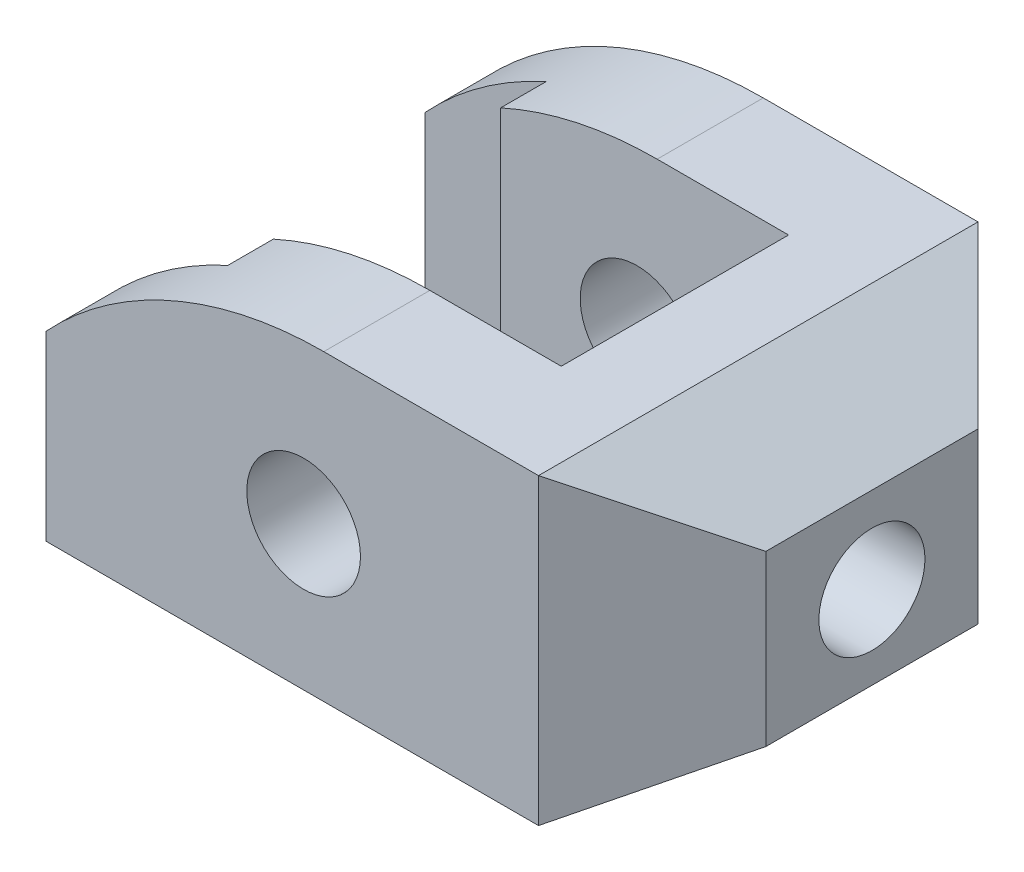
ISO-10303-21;
HEADER;
FILE_DESCRIPTION(('STEP AP214'),'2;1');
FILE_NAME('part.step','',(''),(''),'','','');
FILE_SCHEMA(('AUTOMOTIVE_DESIGN { 1 0 10303 214 1 1 1 1 }'));
ENDSEC;
DATA;
#1=APPLICATION_CONTEXT('core data for automotive mechanical design processes');
#2=APPLICATION_PROTOCOL_DEFINITION('international standard','automotive_design',2000,#1);
#3=PRODUCT_CONTEXT('',#1,'mechanical');
#4=PRODUCT('Part','Part','',(#3));
#5=PRODUCT_RELATED_PRODUCT_CATEGORY('part','',(#4));
#6=PRODUCT_DEFINITION_FORMATION('','',#4);
#7=PRODUCT_DEFINITION_CONTEXT('part definition',#1,'design');
#8=PRODUCT_DEFINITION('design','',#6,#7);
#9=PRODUCT_DEFINITION_SHAPE('','',#8);
#10=(LENGTH_UNIT() NAMED_UNIT(*) SI_UNIT(.MILLI.,.METRE.));
#11=(NAMED_UNIT(*) PLANE_ANGLE_UNIT() SI_UNIT($,.RADIAN.));
#12=(NAMED_UNIT(*) SI_UNIT($,.STERADIAN.) SOLID_ANGLE_UNIT());
#13=UNCERTAINTY_MEASURE_WITH_UNIT(LENGTH_MEASURE(1.E-05),#10,'distance_accuracy_value','');
#14=(GEOMETRIC_REPRESENTATION_CONTEXT(3) GLOBAL_UNCERTAINTY_ASSIGNED_CONTEXT((#13)) GLOBAL_UNIT_ASSIGNED_CONTEXT((#10,
#11,#12)) REPRESENTATION_CONTEXT('',''));
#15=CARTESIAN_POINT('',(0.,0.,0.));
#16=DIRECTION('',(0.,0.,1.));
#17=DIRECTION('',(1.,0.,0.));
#18=AXIS2_PLACEMENT_3D('',#15,#16,#17);
#19=CARTESIAN_POINT('',(0.,0.,-58.));
#20=DIRECTION('',(-1.,0.,0.));
#21=DIRECTION('',(0.,0.,1.));
#22=AXIS2_PLACEMENT_3D('',#19,#20,#21);
#23=PLANE('',#22);
#24=DIRECTION('',(0.,-1.,0.));
#25=VECTOR('',#24,1.);
#26=CARTESIAN_POINT('',(0.,40.,-8.));
#27=LINE('',#26,#25);
#28=CARTESIAN_POINT('',(0.,24.,-8.));
#29=VERTEX_POINT('',#28);
#30=CARTESIAN_POINT('',(0.,0.,-8.));
#31=VERTEX_POINT('',#30);
#32=EDGE_CURVE('E202',#29,#31,#27,.T.);
#33=ORIENTED_EDGE('',*,*,#32,.T.);
#34=DIRECTION('',(0.,0.,1.));
#35=VECTOR('',#34,1.);
#36=CARTESIAN_POINT('',(0.,0.,-58.));
#37=LINE('',#36,#35);
#38=CARTESIAN_POINT('',(0.,0.,0.));
#39=VERTEX_POINT('',#38);
#40=EDGE_CURVE('E279',#31,#39,#37,.T.);
#41=ORIENTED_EDGE('',*,*,#40,.T.);
#42=DIRECTION('',(0.,-1.,0.));
#43=VECTOR('',#42,1.);
#44=CARTESIAN_POINT('',(0.,0.,0.));
#45=LINE('',#44,#43);
#46=CARTESIAN_POINT('',(0.,24.,0.));
#47=VERTEX_POINT('',#46);
#48=EDGE_CURVE('E266',#47,#39,#45,.T.);
#49=ORIENTED_EDGE('',*,*,#48,.F.);
#50=DIRECTION('',(0.,0.,1.));
#51=VECTOR('',#50,1.);
#52=CARTESIAN_POINT('',(0.,24.,-58.));
#53=LINE('',#52,#51);
#54=EDGE_CURVE('E51',#29,#47,#53,.T.);
#55=ORIENTED_EDGE('',*,*,#54,.F.);
#56=EDGE_LOOP('',(#33,#41,#49,#55));
#57=FACE_BOUND('',#56,.T.);
#58=ADVANCED_FACE('F42',(#57),#23,.T.);
#59=CARTESIAN_POINT('',(36.6606055596467,-10.,-58.));
#60=DIRECTION('',(0.,0.,1.));
#61=DIRECTION('',(1.,0.,0.));
#62=AXIS2_PLACEMENT_3D('',#59,#60,#61);
#63=CYLINDRICAL_SURFACE('',#62,50.);
#64=CARTESIAN_POINT('',(36.6606055596467,-10.,-8.));
#65=DIRECTION('',(0.,0.,1.));
#66=DIRECTION('',(1.,0.,0.));
#67=AXIS2_PLACEMENT_3D('',#64,#65,#66);
#68=CIRCLE('',#67,50.);
#69=CARTESIAN_POINT('',(16.,35.5317403347236,-8.));
#70=VERTEX_POINT('',#69);
#71=EDGE_CURVE('E238',#29,#70,#68,.F.);
#72=ORIENTED_EDGE('',*,*,#71,.F.);
#73=ORIENTED_EDGE('',*,*,#54,.T.);
#74=CARTESIAN_POINT('',(36.6606055596467,-10.,0.));
#75=DIRECTION('',(0.,0.,1.));
#76=DIRECTION('',(-1.,0.,0.));
#77=AXIS2_PLACEMENT_3D('',#74,#75,#76);
#78=CIRCLE('',#77,50.);
#79=CARTESIAN_POINT('',(36.6606055596467,40.,0.));
#80=VERTEX_POINT('',#79);
#81=EDGE_CURVE('E272',#80,#47,#78,.T.);
#82=ORIENTED_EDGE('',*,*,#81,.F.);
#83=DIRECTION('',(0.,0.,1.));
#84=VECTOR('',#83,1.);
#85=CARTESIAN_POINT('',(36.6606055596467,40.,-58.));
#86=LINE('',#85,#84);
#87=CARTESIAN_POINT('',(36.6606055596467,40.,-14.));
#88=VERTEX_POINT('',#87);
#89=EDGE_CURVE('E291',#88,#80,#86,.T.);
#90=ORIENTED_EDGE('',*,*,#89,.F.);
#91=CARTESIAN_POINT('',(36.6606055596467,-10.,-14.));
#92=DIRECTION('',(0.,0.,1.));
#93=DIRECTION('',(1.,0.,0.));
#94=AXIS2_PLACEMENT_3D('',#91,#92,#93);
#95=CIRCLE('',#94,50.);
#96=CARTESIAN_POINT('',(16.,35.5317403347236,-14.));
#97=VERTEX_POINT('',#96);
#98=EDGE_CURVE('E230',#97,#88,#95,.F.);
#99=ORIENTED_EDGE('',*,*,#98,.F.);
#100=DIRECTION('',(0.,0.,1.));
#101=VECTOR('',#100,1.);
#102=CARTESIAN_POINT('',(16.,35.5317403347236,-58.));
#103=LINE('',#102,#101);
#104=EDGE_CURVE('E236',#70,#97,#103,.F.);
#105=ORIENTED_EDGE('',*,*,#104,.F.);
#106=EDGE_LOOP('',(#72,#73,#82,#90,#99,#105));
#107=FACE_BOUND('',#106,.T.);
#108=ADVANCED_FACE('F330',(#107),#63,.T.);
#109=CARTESIAN_POINT('',(34.,19.,-58.));
#110=DIRECTION('',(0.,0.,1.));
#111=DIRECTION('',(1.,0.,0.));
#112=AXIS2_PLACEMENT_3D('',#109,#110,#111);
#113=CYLINDRICAL_SURFACE('',#112,7.5);
#114=CARTESIAN_POINT('',(34.,19.,-14.));
#115=DIRECTION('',(0.,0.,1.));
#116=DIRECTION('',(1.,0.,0.));
#117=AXIS2_PLACEMENT_3D('',#114,#115,#116);
#118=CIRCLE('',#117,7.5);
#119=CARTESIAN_POINT('',(41.5,19.,-14.));
#120=VERTEX_POINT('',#119);
#121=EDGE_CURVE('E229',#120,#120,#118,.F.);
#122=CARTESIAN_POINT('',(34.,19.,0.));
#123=DIRECTION('',(0.,0.,1.));
#124=DIRECTION('',(1.,0.,0.));
#125=AXIS2_PLACEMENT_3D('',#122,#123,#124);
#126=CIRCLE('',#125,7.5);
#127=CARTESIAN_POINT('',(41.5,19.,0.));
#128=VERTEX_POINT('',#127);
#129=EDGE_CURVE('E262',#128,#128,#126,.T.);
#130=CARTESIAN_POINT('',(41.5,19.,-14.));
#131=CARTESIAN_POINT('',(41.5,19.,-13.8541666666667));
#132=CARTESIAN_POINT('',(41.5,19.,-13.7083333333333));
#133=CARTESIAN_POINT('',(41.5,19.,-13.4166666666667));
#134=CARTESIAN_POINT('',(41.5,19.,-13.2708333333333));
#135=CARTESIAN_POINT('',(41.5,19.,-12.9791666666667));
#136=CARTESIAN_POINT('',(41.5,19.,-12.8333333333333));
#137=CARTESIAN_POINT('',(41.5,19.,-12.5416666666667));
#138=CARTESIAN_POINT('',(41.5,19.,-12.3958333333333));
#139=CARTESIAN_POINT('',(41.5,19.,-12.1041666666667));
#140=CARTESIAN_POINT('',(41.5,19.,-11.9583333333333));
#141=CARTESIAN_POINT('',(41.5,19.,-11.6666666666667));
#142=CARTESIAN_POINT('',(41.5,19.,-11.5208333333333));
#143=CARTESIAN_POINT('',(41.5,19.,-11.2291666666667));
#144=CARTESIAN_POINT('',(41.5,19.,-11.0833333333333));
#145=CARTESIAN_POINT('',(41.5,19.,-10.7916666666667));
#146=CARTESIAN_POINT('',(41.5,19.,-10.6458333333333));
#147=CARTESIAN_POINT('',(41.5,19.,-10.3541666666667));
#148=CARTESIAN_POINT('',(41.5,19.,-10.2083333333333));
#149=CARTESIAN_POINT('',(41.5,19.,-9.91666666666667));
#150=CARTESIAN_POINT('',(41.5,19.,-9.77083333333333));
#151=CARTESIAN_POINT('',(41.5,19.,-9.47916666666667));
#152=CARTESIAN_POINT('',(41.5,19.,-9.33333333333333));
#153=CARTESIAN_POINT('',(41.5,19.,-9.04166666666667));
#154=CARTESIAN_POINT('',(41.5,19.,-8.89583333333333));
#155=CARTESIAN_POINT('',(41.5,19.,-8.60416666666667));
#156=CARTESIAN_POINT('',(41.5,19.,-8.45833333333333));
#157=CARTESIAN_POINT('',(41.5,19.,-8.16666666666667));
#158=CARTESIAN_POINT('',(41.5,19.,-8.02083333333333));
#159=CARTESIAN_POINT('',(41.5,19.,-7.72916666666667));
#160=CARTESIAN_POINT('',(41.5,19.,-7.58333333333333));
#161=CARTESIAN_POINT('',(41.5,19.,-7.29166666666667));
#162=CARTESIAN_POINT('',(41.5,19.,-7.14583333333333));
#163=CARTESIAN_POINT('',(41.5,19.,-6.85416666666667));
#164=CARTESIAN_POINT('',(41.5,19.,-6.70833333333333));
#165=CARTESIAN_POINT('',(41.5,19.,-6.41666666666667));
#166=CARTESIAN_POINT('',(41.5,19.,-6.27083333333333));
#167=CARTESIAN_POINT('',(41.5,19.,-5.97916666666667));
#168=CARTESIAN_POINT('',(41.5,19.,-5.83333333333333));
#169=CARTESIAN_POINT('',(41.5,19.,-5.54166666666666));
#170=CARTESIAN_POINT('',(41.5,19.,-5.39583333333333));
#171=CARTESIAN_POINT('',(41.5,19.,-5.10416666666666));
#172=CARTESIAN_POINT('',(41.5,19.,-4.95833333333333));
#173=CARTESIAN_POINT('',(41.5,19.,-4.66666666666667));
#174=CARTESIAN_POINT('',(41.5,19.,-4.52083333333333));
#175=CARTESIAN_POINT('',(41.5,19.,-4.22916666666667));
#176=CARTESIAN_POINT('',(41.5,19.,-4.08333333333333));
#177=CARTESIAN_POINT('',(41.5,19.,-3.79166666666667));
#178=CARTESIAN_POINT('',(41.5,19.,-3.64583333333333));
#179=CARTESIAN_POINT('',(41.5,19.,-3.35416666666667));
#180=CARTESIAN_POINT('',(41.5,19.,-3.20833333333333));
#181=CARTESIAN_POINT('',(41.5,19.,-2.91666666666666));
#182=CARTESIAN_POINT('',(41.5,19.,-2.77083333333333));
#183=CARTESIAN_POINT('',(41.5,19.,-2.47916666666667));
#184=CARTESIAN_POINT('',(41.5,19.,-2.33333333333334));
#185=CARTESIAN_POINT('',(41.5,19.,-2.04166666666667));
#186=CARTESIAN_POINT('',(41.5,19.,-1.89583333333333));
#187=CARTESIAN_POINT('',(41.5,19.,-1.60416666666667));
#188=CARTESIAN_POINT('',(41.5,19.,-1.45833333333333));
#189=CARTESIAN_POINT('',(41.5,19.,-1.16666666666667));
#190=CARTESIAN_POINT('',(41.5,19.,-1.02083333333333));
#191=CARTESIAN_POINT('',(41.5,19.,-0.729166666666667));
#192=CARTESIAN_POINT('',(41.5,19.,-0.583333333333334));
#193=CARTESIAN_POINT('',(41.5,19.,-0.291666666666667));
#194=CARTESIAN_POINT('',(41.5,19.,-0.145833333333333));
#195=CARTESIAN_POINT('',(41.5,19.,0.));
#196=B_SPLINE_CURVE_WITH_KNOTS('',3,(#130,#131,#132,#133,#134,#135,#136,#137,#138,#139,#140,
#141,#142,#143,#144,#145,#146,#147,#148,#149,#150,#151,#152,#153,#154,#155,#156,#157,#158,#159,
#160,#161,#162,#163,#164,#165,#166,#167,#168,#169,#170,#171,#172,#173,#174,#175,#176,#177,#178,
#179,#180,#181,#182,#183,#184,#185,#186,#187,#188,#189,#190,#191,#192,#193,#194,#195),
.UNSPECIFIED.,.F.,.F.,(4,2,2,2,2,2,2,2,2,2,2,2,2,2,2,2,2,2,2,2,2,2,2,2,2,2,2,2,2,2,2,2,4),(0.,
0.4375,0.875000000000001,1.3125,1.75,2.1875,2.625,3.0625,3.5,3.9375,4.375,4.8125,5.25,5.6875,
6.125,6.5625,7.,7.4375,7.875,8.3125,8.75,9.1875,9.62499999999999,10.0625,10.5,10.9375,11.375,
11.8125,12.25,12.6875,13.125,13.5625,14.),.UNSPECIFIED.);
#197=EDGE_CURVE('BSEAM309',#120,#128,#196,.T.);
#198=ORIENTED_EDGE('',*,*,#121,.T.);
#199=ORIENTED_EDGE('',*,*,#129,.T.);
#200=ORIENTED_EDGE('',*,*,#197,.T.);
#201=ORIENTED_EDGE('',*,*,#197,.F.);
#202=EDGE_LOOP('',(#198,#200,#199,#201));
#203=FACE_BOUND('',#202,.T.);
#204=ADVANCED_FACE('F309',(#203),#113,.F.);
#205=CARTESIAN_POINT('',(80.,31.3397459621556,-58.));
#206=DIRECTION('',(0.500000000000001,0.866025403784438,0.));
#207=DIRECTION('',(-0.866025403784438,0.500000000000001,0.));
#208=AXIS2_PLACEMENT_3D('',#205,#206,#207);
#209=PLANE('',#208);
#210=DIRECTION('',(0.,0.,1.));
#211=VECTOR('',#210,1.);
#212=CARTESIAN_POINT('',(80.,31.3397459621556,-58.));
#213=LINE('',#212,#211);
#214=CARTESIAN_POINT('',(80.,31.3397459621556,-43.0000000000002));
#215=VERTEX_POINT('',#214);
#216=CARTESIAN_POINT('',(80.,31.3397459621556,-14.9999999999999));
#217=VERTEX_POINT('',#216);
#218=EDGE_CURVE('E295',#215,#217,#213,.T.);
#219=ORIENTED_EDGE('',*,*,#218,.F.);
#220=DIRECTION('',(-0.65465367070798,0.37796447300923,-0.654653670707973));
#221=VECTOR('',#220,1.);
#222=CARTESIAN_POINT('',(73.5714285714287,35.051283406946,-49.4285714285714));
#223=LINE('',#222,#221);
#224=CARTESIAN_POINT('',(65.,40.,-58.));
#225=VERTEX_POINT('',#224);
#226=EDGE_CURVE('E259',#215,#225,#223,.T.);
#227=ORIENTED_EDGE('',*,*,#226,.T.);
#228=DIRECTION('',(0.,0.,1.));
#229=VECTOR('',#228,1.);
#230=CARTESIAN_POINT('',(65.,40.,-58.));
#231=LINE('',#230,#229);
#232=CARTESIAN_POINT('',(65.,40.,0.));
#233=VERTEX_POINT('',#232);
#234=EDGE_CURVE('E292',#225,#233,#231,.T.);
#235=ORIENTED_EDGE('',*,*,#234,.T.);
#236=DIRECTION('',(0.65465367070798,-0.37796447300923,-0.654653670707973));
#237=VECTOR('',#236,1.);
#238=CARTESIAN_POINT('',(98.4285714285714,20.7000052870896,-33.4285714285711));
#239=LINE('',#238,#237);
#240=EDGE_CURVE('E253',#233,#217,#239,.T.);
#241=ORIENTED_EDGE('',*,*,#240,.T.);
#242=EDGE_LOOP('',(#219,#227,#235,#241));
#243=FACE_BOUND('',#242,.T.);
#244=ADVANCED_FACE('F402',(#243),#209,.T.);
#245=CARTESIAN_POINT('',(80.,9.02926263095334,-58.));
#246=DIRECTION('',(1.,0.,0.));
#247=DIRECTION('',(0.,0.,-1.));
#248=AXIS2_PLACEMENT_3D('',#245,#246,#247);
#249=PLANE('',#248);
#250=CARTESIAN_POINT('',(80.,20.,-29.));
#251=DIRECTION('',(1.,0.,0.));
#252=DIRECTION('',(0.,0.,-1.));
#253=AXIS2_PLACEMENT_3D('',#250,#251,#252);
#254=CIRCLE('',#253,7.);
#255=CARTESIAN_POINT('',(80.,20.,-36.));
#256=VERTEX_POINT('',#255);
#257=EDGE_CURVE('E199',#256,#256,#254,.T.);
#258=ORIENTED_EDGE('',*,*,#257,.F.);
#259=EDGE_LOOP('',(#258));
#260=FACE_BOUND('',#259,.T.);
#261=DIRECTION('',(0.,0.,1.));
#262=VECTOR('',#261,1.);
#263=CARTESIAN_POINT('',(80.,9.02926263095334,-58.));
#264=LINE('',#263,#262);
#265=CARTESIAN_POINT('',(80.,9.02926263095334,-43.0000000000002));
#266=VERTEX_POINT('',#265);
#267=CARTESIAN_POINT('',(80.,9.02926263095334,-14.9999999999999));
#268=VERTEX_POINT('',#267);
#269=EDGE_CURVE('E298',#266,#268,#264,.T.);
#270=ORIENTED_EDGE('',*,*,#269,.F.);
#271=DIRECTION('',(0.,-1.,0.));
#272=VECTOR('',#271,1.);
#273=CARTESIAN_POINT('',(80.,40.,-43.0000000000002));
#274=LINE('',#273,#272);
#275=EDGE_CURVE('E241',#215,#266,#274,.T.);
#276=ORIENTED_EDGE('',*,*,#275,.F.);
#277=ORIENTED_EDGE('',*,*,#218,.T.);
#278=DIRECTION('',(0.,-1.,0.));
#279=VECTOR('',#278,1.);
#280=CARTESIAN_POINT('',(80.,40.,-14.9999999999999));
#281=LINE('',#280,#279);
#282=EDGE_CURVE('E240',#217,#268,#281,.T.);
#283=ORIENTED_EDGE('',*,*,#282,.T.);
#284=EDGE_LOOP('',(#270,#276,#277,#283));
#285=FACE_BOUND('',#284,.T.);
#286=ADVANCED_FACE('F405',(#260,#285),#249,.T.);
#287=CARTESIAN_POINT('',(65.,0.,-58.));
#288=DIRECTION('',(0.515724192489074,-0.856754665748307,0.));
#289=DIRECTION('',(0.856754665748307,0.515724192489074,0.));
#290=AXIS2_PLACEMENT_3D('',#287,#288,#289);
#291=PLANE('',#290);
#292=DIRECTION('',(0.,0.,1.));
#293=VECTOR('',#292,1.);
#294=CARTESIAN_POINT('',(65.,0.,-58.));
#295=LINE('',#294,#293);
#296=CARTESIAN_POINT('',(65.,0.,-58.));
#297=VERTEX_POINT('',#296);
#298=CARTESIAN_POINT('',(65.,0.,0.));
#299=VERTEX_POINT('',#298);
#300=EDGE_CURVE('E301',#297,#299,#295,.T.);
#301=ORIENTED_EDGE('',*,*,#300,.F.);
#302=DIRECTION('',(0.650621417420144,0.39164211008064,0.650621417420137));
#303=VECTOR('',#302,1.);
#304=CARTESIAN_POINT('',(65.,0.,-58.));
#305=LINE('',#304,#303);
#306=EDGE_CURVE('E256',#297,#266,#305,.T.);
#307=ORIENTED_EDGE('',*,*,#306,.T.);
#308=ORIENTED_EDGE('',*,*,#269,.T.);
#309=DIRECTION('',(-0.650621417420144,-0.39164211008064,0.650621417420137));
#310=VECTOR('',#309,1.);
#311=CARTESIAN_POINT('',(89.5518772707359,14.7790231973606,-24.5518772707357));
#312=LINE('',#311,#310);
#313=EDGE_CURVE('E247',#268,#299,#312,.T.);
#314=ORIENTED_EDGE('',*,*,#313,.T.);
#315=EDGE_LOOP('',(#301,#307,#308,#314));
#316=FACE_BOUND('',#315,.T.);
#317=ADVANCED_FACE('F397',(#316),#291,.T.);
#318=CARTESIAN_POINT('',(36.6606055596467,-10.,-58.));
#319=DIRECTION('',(0.,0.,-1.));
#320=DIRECTION('',(-1.,0.,0.));
#321=AXIS2_PLACEMENT_3D('',#318,#319,#320);
#322=PLANE('',#321);
#323=CARTESIAN_POINT('',(34.,19.,-58.));
#324=DIRECTION('',(0.,0.,1.));
#325=DIRECTION('',(1.,0.,0.));
#326=AXIS2_PLACEMENT_3D('',#323,#324,#325);
#327=CIRCLE('',#326,7.5);
#328=CARTESIAN_POINT('',(41.5,19.,-58.));
#329=VERTEX_POINT('',#328);
#330=EDGE_CURVE('E263',#329,#329,#327,.T.);
#331=ORIENTED_EDGE('',*,*,#330,.T.);
#332=EDGE_LOOP('',(#331));
#333=FACE_BOUND('',#332,.T.);
#334=DIRECTION('',(-1.,0.,0.));
#335=VECTOR('',#334,1.);
#336=CARTESIAN_POINT('',(65.,40.,-58.));
#337=LINE('',#336,#335);
#338=CARTESIAN_POINT('',(36.6606055596467,40.,-58.));
#339=VERTEX_POINT('',#338);
#340=EDGE_CURVE('E274',#225,#339,#337,.T.);
#341=ORIENTED_EDGE('',*,*,#340,.F.);
#342=DIRECTION('',(0.,-1.,0.));
#343=VECTOR('',#342,1.);
#344=CARTESIAN_POINT('',(65.,40.,-58.));
#345=LINE('',#344,#343);
#346=EDGE_CURVE('E243',#225,#297,#345,.T.);
#347=ORIENTED_EDGE('',*,*,#346,.T.);
#348=DIRECTION('',(1.,0.,0.));
#349=VECTOR('',#348,1.);
#350=CARTESIAN_POINT('',(0.,0.,-58.));
#351=LINE('',#350,#349);
#352=CARTESIAN_POINT('',(0.,0.,-58.));
#353=VERTEX_POINT('',#352);
#354=EDGE_CURVE('E271',#353,#297,#351,.T.);
#355=ORIENTED_EDGE('',*,*,#354,.F.);
#356=DIRECTION('',(0.,-1.,0.));
#357=VECTOR('',#356,1.);
#358=CARTESIAN_POINT('',(0.,0.,-58.));
#359=LINE('',#358,#357);
#360=CARTESIAN_POINT('',(0.,24.,-58.));
#361=VERTEX_POINT('',#360);
#362=EDGE_CURVE('E269',#361,#353,#359,.T.);
#363=ORIENTED_EDGE('',*,*,#362,.F.);
#364=CARTESIAN_POINT('',(36.6606055596467,-10.,-58.));
#365=DIRECTION('',(0.,0.,1.));
#366=DIRECTION('',(-1.,0.,0.));
#367=AXIS2_PLACEMENT_3D('',#364,#365,#366);
#368=CIRCLE('',#367,50.);
#369=EDGE_CURVE('E276',#339,#361,#368,.T.);
#370=ORIENTED_EDGE('',*,*,#369,.F.);
#371=EDGE_LOOP('',(#341,#347,#355,#363,#370));
#372=FACE_BOUND('',#371,.T.);
#373=ADVANCED_FACE('F345',(#333,#372),#322,.T.);
#374=CARTESIAN_POINT('',(36.6606055596467,-10.,0.));
#375=DIRECTION('',(0.,0.,-1.));
#376=DIRECTION('',(-1.,0.,0.));
#377=AXIS2_PLACEMENT_3D('',#374,#375,#376);
#378=PLANE('',#377);
#379=ORIENTED_EDGE('',*,*,#129,.F.);
#380=EDGE_LOOP('',(#379));
#381=FACE_BOUND('',#380,.T.);
#382=DIRECTION('',(0.,-1.,0.));
#383=VECTOR('',#382,1.);
#384=CARTESIAN_POINT('',(65.,40.,0.));
#385=LINE('',#384,#383);
#386=EDGE_CURVE('E244',#233,#299,#385,.T.);
#387=ORIENTED_EDGE('',*,*,#386,.F.);
#388=DIRECTION('',(-1.,0.,0.));
#389=VECTOR('',#388,1.);
#390=CARTESIAN_POINT('',(65.,40.,0.));
#391=LINE('',#390,#389);
#392=EDGE_CURVE('E285',#233,#80,#391,.T.);
#393=ORIENTED_EDGE('',*,*,#392,.T.);
#394=ORIENTED_EDGE('',*,*,#81,.T.);
#395=ORIENTED_EDGE('',*,*,#48,.T.);
#396=DIRECTION('',(1.,0.,0.));
#397=VECTOR('',#396,1.);
#398=CARTESIAN_POINT('',(0.,0.,0.));
#399=LINE('',#398,#397);
#400=EDGE_CURVE('E282',#39,#299,#399,.T.);
#401=ORIENTED_EDGE('',*,*,#400,.T.);
#402=EDGE_LOOP('',(#387,#393,#394,#395,#401));
#403=FACE_BOUND('',#402,.T.);
#404=ADVANCED_FACE('F338',(#381,#403),#378,.F.);
#405=DIRECTION('',(0.,-1.,0.));
#406=VECTOR('',#405,1.);
#407=CARTESIAN_POINT('',(0.,40.,-50.));
#408=LINE('',#407,#406);
#409=CARTESIAN_POINT('',(0.,24.,-50.));
#410=VERTEX_POINT('',#409);
#411=CARTESIAN_POINT('',(0.,0.,-50.));
#412=VERTEX_POINT('',#411);
#413=EDGE_CURVE('E59',#410,#412,#408,.T.);
#414=ORIENTED_EDGE('',*,*,#413,.F.);
#415=EDGE_CURVE('E11',#361,#410,#53,.T.);
#416=ORIENTED_EDGE('',*,*,#415,.F.);
#417=ORIENTED_EDGE('',*,*,#362,.T.);
#418=EDGE_CURVE('E94',#353,#412,#37,.T.);
#419=ORIENTED_EDGE('',*,*,#418,.T.);
#420=EDGE_LOOP('',(#414,#416,#417,#419));
#421=FACE_BOUND('',#420,.T.);
#422=ADVANCED_FACE('F44',(#421),#23,.T.);
#423=CARTESIAN_POINT('',(36.6606055596467,-10.,-44.));
#424=DIRECTION('',(0.,0.,-1.));
#425=DIRECTION('',(-1.,0.,0.));
#426=AXIS2_PLACEMENT_3D('',#423,#424,#425);
#427=CIRCLE('',#426,50.);
#428=CARTESIAN_POINT('',(36.6606055596467,40.,-44.));
#429=VERTEX_POINT('',#428);
#430=CARTESIAN_POINT('',(16.,35.5317403347236,-44.));
#431=VERTEX_POINT('',#430);
#432=EDGE_CURVE('E227',#429,#431,#427,.F.);
#433=ORIENTED_EDGE('',*,*,#432,.F.);
#434=EDGE_CURVE('E192',#339,#429,#86,.T.);
#435=ORIENTED_EDGE('',*,*,#434,.F.);
#436=ORIENTED_EDGE('',*,*,#369,.T.);
#437=ORIENTED_EDGE('',*,*,#415,.T.);
#438=CARTESIAN_POINT('',(36.6606055596467,-10.,-50.));
#439=DIRECTION('',(0.,0.,-1.));
#440=DIRECTION('',(-1.,0.,0.));
#441=AXIS2_PLACEMENT_3D('',#438,#439,#440);
#442=CIRCLE('',#441,50.);
#443=CARTESIAN_POINT('',(16.,35.5317403347236,-50.));
#444=VERTEX_POINT('',#443);
#445=EDGE_CURVE('E232',#444,#410,#442,.F.);
#446=ORIENTED_EDGE('',*,*,#445,.F.);
#447=DIRECTION('',(0.,0.,1.));
#448=VECTOR('',#447,1.);
#449=CARTESIAN_POINT('',(16.,35.5317403347236,-58.));
#450=LINE('',#449,#448);
#451=EDGE_CURVE('E234',#431,#444,#450,.F.);
#452=ORIENTED_EDGE('',*,*,#451,.F.);
#453=EDGE_LOOP('',(#433,#435,#436,#437,#446,#452));
#454=FACE_BOUND('',#453,.T.);
#455=ADVANCED_FACE('F336',(#454),#63,.T.);
#456=CARTESIAN_POINT('',(65.,40.,-58.));
#457=DIRECTION('',(0.,1.,0.));
#458=DIRECTION('',(-1.,0.,0.));
#459=AXIS2_PLACEMENT_3D('',#456,#457,#458);
#460=PLANE('',#459);
#461=DIRECTION('',(-1.,0.,0.));
#462=VECTOR('',#461,1.);
#463=CARTESIAN_POINT('',(16.,40.,-14.));
#464=LINE('',#463,#462);
#465=CARTESIAN_POINT('',(54.,40.,-14.));
#466=VERTEX_POINT('',#465);
#467=EDGE_CURVE('E187',#466,#88,#464,.T.);
#468=ORIENTED_EDGE('',*,*,#467,.T.);
#469=ORIENTED_EDGE('',*,*,#89,.T.);
#470=ORIENTED_EDGE('',*,*,#392,.F.);
#471=ORIENTED_EDGE('',*,*,#234,.F.);
#472=ORIENTED_EDGE('',*,*,#340,.T.);
#473=ORIENTED_EDGE('',*,*,#434,.T.);
#474=DIRECTION('',(1.,0.,0.));
#475=VECTOR('',#474,1.);
#476=CARTESIAN_POINT('',(16.,40.,-44.));
#477=LINE('',#476,#475);
#478=CARTESIAN_POINT('',(54.,40.,-44.));
#479=VERTEX_POINT('',#478);
#480=EDGE_CURVE('E171',#429,#479,#477,.T.);
#481=ORIENTED_EDGE('',*,*,#480,.T.);
#482=DIRECTION('',(0.,0.,1.));
#483=VECTOR('',#482,1.);
#484=CARTESIAN_POINT('',(54.,40.,-14.));
#485=LINE('',#484,#483);
#486=EDGE_CURVE('E182',#479,#466,#485,.T.);
#487=ORIENTED_EDGE('',*,*,#486,.T.);
#488=EDGE_LOOP('',(#468,#469,#470,#471,#472,#473,#481,#487));
#489=FACE_BOUND('',#488,.T.);
#490=ADVANCED_FACE('F190',(#489),#460,.T.);
#491=CARTESIAN_POINT('',(0.,0.,-58.));
#492=DIRECTION('',(0.,-1.,0.));
#493=DIRECTION('',(0.,0.,-1.));
#494=AXIS2_PLACEMENT_3D('',#491,#492,#493);
#495=PLANE('',#494);
#496=DIRECTION('',(-1.,0.,0.));
#497=VECTOR('',#496,1.);
#498=CARTESIAN_POINT('',(0.,0.,-8.));
#499=LINE('',#498,#497);
#500=CARTESIAN_POINT('',(16.,0.,-8.));
#501=VERTEX_POINT('',#500);
#502=EDGE_CURVE('E203',#501,#31,#499,.T.);
#503=ORIENTED_EDGE('',*,*,#502,.F.);
#504=DIRECTION('',(0.,0.,1.));
#505=VECTOR('',#504,1.);
#506=CARTESIAN_POINT('',(16.,0.,-8.));
#507=LINE('',#506,#505);
#508=CARTESIAN_POINT('',(16.,0.,-14.));
#509=VERTEX_POINT('',#508);
#510=EDGE_CURVE('E193',#509,#501,#507,.T.);
#511=ORIENTED_EDGE('',*,*,#510,.F.);
#512=DIRECTION('',(-1.,0.,0.));
#513=VECTOR('',#512,1.);
#514=CARTESIAN_POINT('',(16.,0.,-14.));
#515=LINE('',#514,#513);
#516=CARTESIAN_POINT('',(54.,0.,-14.));
#517=VERTEX_POINT('',#516);
#518=EDGE_CURVE('E196',#517,#509,#515,.T.);
#519=ORIENTED_EDGE('',*,*,#518,.F.);
#520=DIRECTION('',(0.,0.,1.));
#521=VECTOR('',#520,1.);
#522=CARTESIAN_POINT('',(54.,0.,-14.));
#523=LINE('',#522,#521);
#524=CARTESIAN_POINT('',(54.,0.,-44.));
#525=VERTEX_POINT('',#524);
#526=EDGE_CURVE('E211',#525,#517,#523,.T.);
#527=ORIENTED_EDGE('',*,*,#526,.F.);
#528=DIRECTION('',(1.,0.,0.));
#529=VECTOR('',#528,1.);
#530=CARTESIAN_POINT('',(16.,0.,-44.));
#531=LINE('',#530,#529);
#532=CARTESIAN_POINT('',(16.,0.,-44.));
#533=VERTEX_POINT('',#532);
#534=EDGE_CURVE('E174',#533,#525,#531,.T.);
#535=ORIENTED_EDGE('',*,*,#534,.F.);
#536=DIRECTION('',(0.,0.,1.));
#537=VECTOR('',#536,1.);
#538=CARTESIAN_POINT('',(16.,0.,-50.));
#539=LINE('',#538,#537);
#540=CARTESIAN_POINT('',(16.,0.,-50.));
#541=VERTEX_POINT('',#540);
#542=EDGE_CURVE('E207',#541,#533,#539,.T.);
#543=ORIENTED_EDGE('',*,*,#542,.F.);
#544=DIRECTION('',(1.,0.,0.));
#545=VECTOR('',#544,1.);
#546=CARTESIAN_POINT('',(0.,0.,-50.));
#547=LINE('',#546,#545);
#548=EDGE_CURVE('E205',#412,#541,#547,.T.);
#549=ORIENTED_EDGE('',*,*,#548,.F.);
#550=ORIENTED_EDGE('',*,*,#418,.F.);
#551=ORIENTED_EDGE('',*,*,#354,.T.);
#552=ORIENTED_EDGE('',*,*,#300,.T.);
#553=ORIENTED_EDGE('',*,*,#400,.F.);
#554=ORIENTED_EDGE('',*,*,#40,.F.);
#555=EDGE_LOOP('',(#503,#511,#519,#527,#535,#543,#549,#550,#551,#552,#553,#554));
#556=FACE_BOUND('',#555,.T.);
#557=ADVANCED_FACE('F355',(#556),#495,.T.);
#558=CARTESIAN_POINT('',(34.,19.,-44.));
#559=DIRECTION('',(0.,0.,-1.));
#560=DIRECTION('',(-1.,0.,0.));
#561=AXIS2_PLACEMENT_3D('',#558,#559,#560);
#562=CIRCLE('',#561,7.5);
#563=CARTESIAN_POINT('',(41.5,19.,-44.));
#564=VERTEX_POINT('',#563);
#565=EDGE_CURVE('E217',#564,#564,#562,.F.);
#566=CARTESIAN_POINT('',(41.5,19.,-44.));
#567=CARTESIAN_POINT('',(41.5,19.,-44.1458333333334));
#568=CARTESIAN_POINT('',(41.5,19.,-44.2916666666667));
#569=CARTESIAN_POINT('',(41.5,19.,-44.5833333333334));
#570=CARTESIAN_POINT('',(41.5,19.,-44.7291666666667));
#571=CARTESIAN_POINT('',(41.5,19.,-45.0208333333334));
#572=CARTESIAN_POINT('',(41.5,19.,-45.1666666666667));
#573=CARTESIAN_POINT('',(41.5,19.,-45.4583333333334));
#574=CARTESIAN_POINT('',(41.5,19.,-45.6041666666667));
#575=CARTESIAN_POINT('',(41.5,19.,-45.8958333333334));
#576=CARTESIAN_POINT('',(41.5,19.,-46.0416666666667));
#577=CARTESIAN_POINT('',(41.5,19.,-46.3333333333334));
#578=CARTESIAN_POINT('',(41.5,19.,-46.4791666666667));
#579=CARTESIAN_POINT('',(41.5,19.,-46.7708333333334));
#580=CARTESIAN_POINT('',(41.5,19.,-46.9166666666667));
#581=CARTESIAN_POINT('',(41.5,19.,-47.2083333333334));
#582=CARTESIAN_POINT('',(41.5,19.,-47.3541666666667));
#583=CARTESIAN_POINT('',(41.5,19.,-47.6458333333334));
#584=CARTESIAN_POINT('',(41.5,19.,-47.7916666666667));
#585=CARTESIAN_POINT('',(41.5,19.,-48.0833333333333));
#586=CARTESIAN_POINT('',(41.5,19.,-48.2291666666667));
#587=CARTESIAN_POINT('',(41.5,19.,-48.5208333333333));
#588=CARTESIAN_POINT('',(41.5,19.,-48.6666666666667));
#589=CARTESIAN_POINT('',(41.5,19.,-48.9583333333334));
#590=CARTESIAN_POINT('',(41.5,19.,-49.1041666666667));
#591=CARTESIAN_POINT('',(41.5,19.,-49.3958333333334));
#592=CARTESIAN_POINT('',(41.5,19.,-49.5416666666667));
#593=CARTESIAN_POINT('',(41.5,19.,-49.8333333333334));
#594=CARTESIAN_POINT('',(41.5,19.,-49.9791666666667));
#595=CARTESIAN_POINT('',(41.5,19.,-50.2708333333333));
#596=CARTESIAN_POINT('',(41.5,19.,-50.4166666666667));
#597=CARTESIAN_POINT('',(41.5,19.,-50.7083333333333));
#598=CARTESIAN_POINT('',(41.5,19.,-50.8541666666667));
#599=CARTESIAN_POINT('',(41.5,19.,-51.1458333333333));
#600=CARTESIAN_POINT('',(41.5,19.,-51.2916666666667));
#601=CARTESIAN_POINT('',(41.5,19.,-51.5833333333333));
#602=CARTESIAN_POINT('',(41.5,19.,-51.7291666666667));
#603=CARTESIAN_POINT('',(41.5,19.,-52.0208333333333));
#604=CARTESIAN_POINT('',(41.5,19.,-52.1666666666667));
#605=CARTESIAN_POINT('',(41.5,19.,-52.4583333333333));
#606=CARTESIAN_POINT('',(41.5,19.,-52.6041666666667));
#607=CARTESIAN_POINT('',(41.5,19.,-52.8958333333333));
#608=CARTESIAN_POINT('',(41.5,19.,-53.0416666666667));
#609=CARTESIAN_POINT('',(41.5,19.,-53.3333333333333));
#610=CARTESIAN_POINT('',(41.5,19.,-53.4791666666667));
#611=CARTESIAN_POINT('',(41.5,19.,-53.7708333333333));
#612=CARTESIAN_POINT('',(41.5,19.,-53.9166666666667));
#613=CARTESIAN_POINT('',(41.5,19.,-54.2083333333333));
#614=CARTESIAN_POINT('',(41.5,19.,-54.3541666666667));
#615=CARTESIAN_POINT('',(41.5,19.,-54.6458333333333));
#616=CARTESIAN_POINT('',(41.5,19.,-54.7916666666667));
#617=CARTESIAN_POINT('',(41.5,19.,-55.0833333333333));
#618=CARTESIAN_POINT('',(41.5,19.,-55.2291666666667));
#619=CARTESIAN_POINT('',(41.5,19.,-55.5208333333333));
#620=CARTESIAN_POINT('',(41.5,19.,-55.6666666666667));
#621=CARTESIAN_POINT('',(41.5,19.,-55.9583333333333));
#622=CARTESIAN_POINT('',(41.5,19.,-56.1041666666667));
#623=CARTESIAN_POINT('',(41.5,19.,-56.3958333333333));
#624=CARTESIAN_POINT('',(41.5,19.,-56.5416666666667));
#625=CARTESIAN_POINT('',(41.5,19.,-56.8333333333333));
#626=CARTESIAN_POINT('',(41.5,19.,-56.9791666666667));
#627=CARTESIAN_POINT('',(41.5,19.,-57.2708333333333));
#628=CARTESIAN_POINT('',(41.5,19.,-57.4166666666667));
#629=CARTESIAN_POINT('',(41.5,19.,-57.7083333333333));
#630=CARTESIAN_POINT('',(41.5,19.,-57.8541666666667));
#631=CARTESIAN_POINT('',(41.5,19.,-58.));
#632=B_SPLINE_CURVE_WITH_KNOTS('',3,(#566,#567,#568,#569,#570,#571,#572,#573,#574,#575,#576,
#577,#578,#579,#580,#581,#582,#583,#584,#585,#586,#587,#588,#589,#590,#591,#592,#593,#594,#595,
#596,#597,#598,#599,#600,#601,#602,#603,#604,#605,#606,#607,#608,#609,#610,#611,#612,#613,#614,
#615,#616,#617,#618,#619,#620,#621,#622,#623,#624,#625,#626,#627,#628,#629,#630,#631),
.UNSPECIFIED.,.F.,.F.,(4,2,2,2,2,2,2,2,2,2,2,2,2,2,2,2,2,2,2,2,2,2,2,2,2,2,2,2,2,2,2,2,4),(0.,
0.4375,0.874999999999994,1.31249999999999,1.74999999999999,2.1875,2.625,3.0625,3.5,
3.93749999999999,4.37499999999999,4.81249999999999,5.24999999999999,5.68749999999999,
6.12499999999998,6.56249999999998,6.99999999999999,7.43749999999999,7.87499999999999,
8.31249999999999,8.74999999999999,9.18749999999998,9.62499999999998,10.0625,10.5,10.9375,11.375,
11.8125,12.25,12.6875,13.125,13.5625,14.),.UNSPECIFIED.);
#633=EDGE_CURVE('BSEAM392',#564,#329,#632,.T.);
#634=ORIENTED_EDGE('',*,*,#565,.T.);
#635=ORIENTED_EDGE('',*,*,#330,.F.);
#636=ORIENTED_EDGE('',*,*,#633,.T.);
#637=ORIENTED_EDGE('',*,*,#633,.F.);
#638=EDGE_LOOP('',(#634,#636,#635,#637));
#639=FACE_BOUND('',#638,.T.);
#640=ADVANCED_FACE('F392',(#639),#113,.F.);
#641=CARTESIAN_POINT('',(65.,40.,0.));
#642=DIRECTION('',(0.707106781186544,0.,0.707106781186551));
#643=DIRECTION('',(0.707106781186551,0.,-0.707106781186544));
#644=AXIS2_PLACEMENT_3D('',#641,#642,#643);
#645=PLANE('',#644);
#646=ORIENTED_EDGE('',*,*,#386,.T.);
#647=ORIENTED_EDGE('',*,*,#313,.F.);
#648=ORIENTED_EDGE('',*,*,#282,.F.);
#649=ORIENTED_EDGE('',*,*,#240,.F.);
#650=EDGE_LOOP('',(#646,#647,#648,#649));
#651=FACE_BOUND('',#650,.T.);
#652=ADVANCED_FACE('F324',(#651),#645,.T.);
#653=CARTESIAN_POINT('',(65.,40.,-58.));
#654=DIRECTION('',(0.707106781186544,0.,-0.707106781186551));
#655=DIRECTION('',(-0.707106781186551,0.,-0.707106781186544));
#656=AXIS2_PLACEMENT_3D('',#653,#654,#655);
#657=PLANE('',#656);
#658=ORIENTED_EDGE('',*,*,#275,.T.);
#659=ORIENTED_EDGE('',*,*,#306,.F.);
#660=ORIENTED_EDGE('',*,*,#346,.F.);
#661=ORIENTED_EDGE('',*,*,#226,.F.);
#662=EDGE_LOOP('',(#658,#659,#660,#661));
#663=FACE_BOUND('',#662,.T.);
#664=ADVANCED_FACE('F314',(#663),#657,.T.);
#665=CARTESIAN_POINT('',(16.,40.,-14.));
#666=DIRECTION('',(0.,0.,1.));
#667=DIRECTION('',(1.,0.,0.));
#668=AXIS2_PLACEMENT_3D('',#665,#666,#667);
#669=PLANE('',#668);
#670=ORIENTED_EDGE('',*,*,#98,.T.);
#671=ORIENTED_EDGE('',*,*,#467,.F.);
#672=DIRECTION('',(0.,-1.,0.));
#673=VECTOR('',#672,1.);
#674=CARTESIAN_POINT('',(54.,40.,-14.));
#675=LINE('',#674,#673);
#676=EDGE_CURVE('E178',#466,#517,#675,.T.);
#677=ORIENTED_EDGE('',*,*,#676,.T.);
#678=ORIENTED_EDGE('',*,*,#518,.T.);
#679=DIRECTION('',(0.,-1.,0.));
#680=VECTOR('',#679,1.);
#681=CARTESIAN_POINT('',(16.,40.,-14.));
#682=LINE('',#681,#680);
#683=EDGE_CURVE('E218',#97,#509,#682,.T.);
#684=ORIENTED_EDGE('',*,*,#683,.F.);
#685=EDGE_LOOP('',(#670,#671,#677,#678,#684));
#686=FACE_BOUND('',#685,.T.);
#687=ORIENTED_EDGE('',*,*,#121,.F.);
#688=EDGE_LOOP('',(#687));
#689=FACE_BOUND('',#688,.T.);
#690=ADVANCED_FACE('F312',(#686,#689),#669,.F.);
#691=CARTESIAN_POINT('',(16.,40.,-44.));
#692=DIRECTION('',(0.,0.,-1.));
#693=DIRECTION('',(-1.,0.,0.));
#694=AXIS2_PLACEMENT_3D('',#691,#692,#693);
#695=PLANE('',#694);
#696=ORIENTED_EDGE('',*,*,#432,.T.);
#697=DIRECTION('',(0.,-1.,0.));
#698=VECTOR('',#697,1.);
#699=CARTESIAN_POINT('',(16.,40.,-44.));
#700=LINE('',#699,#698);
#701=EDGE_CURVE('E179',#431,#533,#700,.T.);
#702=ORIENTED_EDGE('',*,*,#701,.T.);
#703=ORIENTED_EDGE('',*,*,#534,.T.);
#704=DIRECTION('',(0.,-1.,0.));
#705=VECTOR('',#704,1.);
#706=CARTESIAN_POINT('',(54.,40.,-44.));
#707=LINE('',#706,#705);
#708=EDGE_CURVE('E166',#479,#525,#707,.T.);
#709=ORIENTED_EDGE('',*,*,#708,.F.);
#710=ORIENTED_EDGE('',*,*,#480,.F.);
#711=EDGE_LOOP('',(#696,#702,#703,#709,#710));
#712=FACE_BOUND('',#711,.T.);
#713=ORIENTED_EDGE('',*,*,#565,.F.);
#714=EDGE_LOOP('',(#713));
#715=FACE_BOUND('',#714,.T.);
#716=ADVANCED_FACE('F168',(#712,#715),#695,.F.);
#717=CARTESIAN_POINT('',(0.,40.,-8.));
#718=DIRECTION('',(0.,0.,1.));
#719=DIRECTION('',(1.,0.,0.));
#720=AXIS2_PLACEMENT_3D('',#717,#718,#719);
#721=PLANE('',#720);
#722=ORIENTED_EDGE('',*,*,#71,.T.);
#723=DIRECTION('',(0.,-1.,0.));
#724=VECTOR('',#723,1.);
#725=CARTESIAN_POINT('',(16.,40.,-8.));
#726=LINE('',#725,#724);
#727=EDGE_CURVE('E215',#70,#501,#726,.T.);
#728=ORIENTED_EDGE('',*,*,#727,.T.);
#729=ORIENTED_EDGE('',*,*,#502,.T.);
#730=ORIENTED_EDGE('',*,*,#32,.F.);
#731=EDGE_LOOP('',(#722,#728,#729,#730));
#732=FACE_BOUND('',#731,.T.);
#733=ADVANCED_FACE('F321',(#732),#721,.F.);
#734=CARTESIAN_POINT('',(16.,40.,-8.));
#735=DIRECTION('',(1.,0.,0.));
#736=DIRECTION('',(0.,0.,-1.));
#737=AXIS2_PLACEMENT_3D('',#734,#735,#736);
#738=PLANE('',#737);
#739=ORIENTED_EDGE('',*,*,#104,.T.);
#740=ORIENTED_EDGE('',*,*,#683,.T.);
#741=ORIENTED_EDGE('',*,*,#510,.T.);
#742=ORIENTED_EDGE('',*,*,#727,.F.);
#743=EDGE_LOOP('',(#739,#740,#741,#742));
#744=FACE_BOUND('',#743,.T.);
#745=ADVANCED_FACE('F367',(#744),#738,.F.);
#746=CARTESIAN_POINT('',(54.,40.,-14.));
#747=DIRECTION('',(1.,0.,0.));
#748=DIRECTION('',(0.,0.,-1.));
#749=AXIS2_PLACEMENT_3D('',#746,#747,#748);
#750=PLANE('',#749);
#751=CARTESIAN_POINT('',(54.,20.,-29.));
#752=DIRECTION('',(1.,0.,0.));
#753=DIRECTION('',(0.,0.,-1.));
#754=AXIS2_PLACEMENT_3D('',#751,#752,#753);
#755=CIRCLE('',#754,7.);
#756=CARTESIAN_POINT('',(54.,20.,-36.));
#757=VERTEX_POINT('',#756);
#758=EDGE_CURVE('E46',#757,#757,#755,.T.);
#759=ORIENTED_EDGE('',*,*,#758,.T.);
#760=EDGE_LOOP('',(#759));
#761=FACE_BOUND('',#760,.T.);
#762=ORIENTED_EDGE('',*,*,#526,.T.);
#763=ORIENTED_EDGE('',*,*,#676,.F.);
#764=ORIENTED_EDGE('',*,*,#486,.F.);
#765=ORIENTED_EDGE('',*,*,#708,.T.);
#766=EDGE_LOOP('',(#762,#763,#764,#765));
#767=FACE_BOUND('',#766,.T.);
#768=ADVANCED_FACE('F183',(#761,#767),#750,.F.);
#769=CARTESIAN_POINT('',(16.,40.,-50.));
#770=DIRECTION('',(1.,0.,0.));
#771=DIRECTION('',(0.,0.,-1.));
#772=AXIS2_PLACEMENT_3D('',#769,#770,#771);
#773=PLANE('',#772);
#774=ORIENTED_EDGE('',*,*,#451,.T.);
#775=DIRECTION('',(0.,-1.,0.));
#776=VECTOR('',#775,1.);
#777=CARTESIAN_POINT('',(16.,40.,-50.));
#778=LINE('',#777,#776);
#779=EDGE_CURVE('E222',#444,#541,#778,.T.);
#780=ORIENTED_EDGE('',*,*,#779,.T.);
#781=ORIENTED_EDGE('',*,*,#542,.T.);
#782=ORIENTED_EDGE('',*,*,#701,.F.);
#783=EDGE_LOOP('',(#774,#780,#781,#782));
#784=FACE_BOUND('',#783,.T.);
#785=ADVANCED_FACE('F373',(#784),#773,.F.);
#786=CARTESIAN_POINT('',(0.,40.,-50.));
#787=DIRECTION('',(0.,0.,-1.));
#788=DIRECTION('',(-1.,0.,0.));
#789=AXIS2_PLACEMENT_3D('',#786,#787,#788);
#790=PLANE('',#789);
#791=ORIENTED_EDGE('',*,*,#445,.T.);
#792=ORIENTED_EDGE('',*,*,#413,.T.);
#793=ORIENTED_EDGE('',*,*,#548,.T.);
#794=ORIENTED_EDGE('',*,*,#779,.F.);
#795=EDGE_LOOP('',(#791,#792,#793,#794));
#796=FACE_BOUND('',#795,.T.);
#797=ADVANCED_FACE('F375',(#796),#790,.F.);
#798=CARTESIAN_POINT('',(0.,20.,-29.));
#799=DIRECTION('',(1.,0.,0.));
#800=DIRECTION('',(0.,0.,-1.));
#801=AXIS2_PLACEMENT_3D('',#798,#799,#800);
#802=CYLINDRICAL_SURFACE('',#801,7.);
#803=ORIENTED_EDGE('',*,*,#257,.T.);
#804=EDGE_LOOP('',(#803));
#805=FACE_BOUND('',#804,.T.);
#806=ORIENTED_EDGE('',*,*,#758,.F.);
#807=EDGE_LOOP('',(#806));
#808=FACE_BOUND('',#807,.T.);
#809=ADVANCED_FACE('F377',(#805,#808),#802,.F.);
#810=CLOSED_SHELL('',(#58,#108,#204,#244,#286,#317,#373,#404,#422,#455,#490,#557,#640,#652,#664,
#690,#716,#733,#745,#768,#785,#797,#809));
#811=MANIFOLD_SOLID_BREP('B2',#810);
#812=ADVANCED_BREP_SHAPE_REPRESENTATION('',(#18,#811),#14);
#813=SHAPE_DEFINITION_REPRESENTATION(#9,#812);
ENDSEC;
END-ISO-10303-21;
